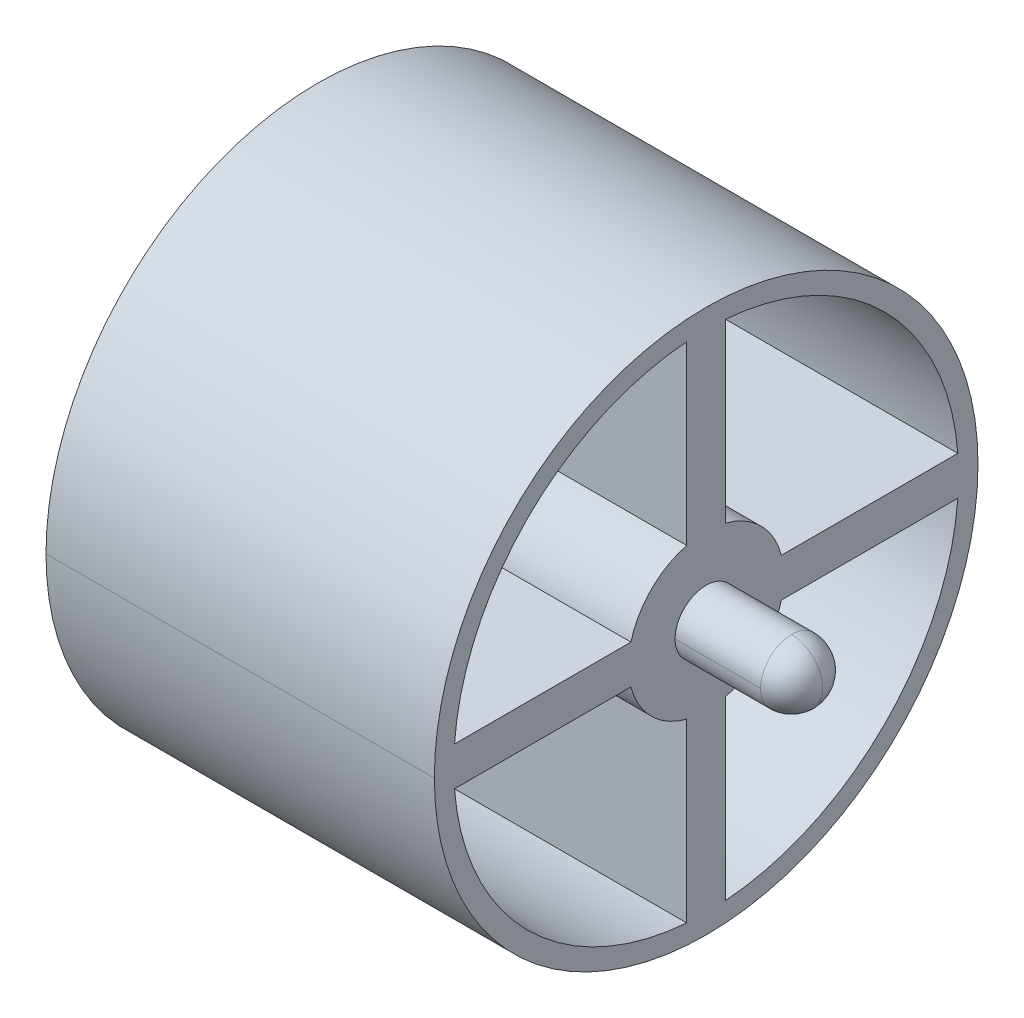
ISO-10303-21;
HEADER;
FILE_DESCRIPTION(('STEP AP214'),'2;1');
FILE_NAME('part.step','',(''),(''),'','','');
FILE_SCHEMA(('AUTOMOTIVE_DESIGN { 1 0 10303 214 1 1 1 1 }'));
ENDSEC;
DATA;
#1=APPLICATION_CONTEXT('core data for automotive mechanical design processes');
#2=APPLICATION_PROTOCOL_DEFINITION('international standard','automotive_design',2000,#1);
#3=PRODUCT_CONTEXT('',#1,'mechanical');
#4=PRODUCT('Part','Part','',(#3));
#5=PRODUCT_RELATED_PRODUCT_CATEGORY('part','',(#4));
#6=PRODUCT_DEFINITION_FORMATION('','',#4);
#7=PRODUCT_DEFINITION_CONTEXT('part definition',#1,'design');
#8=PRODUCT_DEFINITION('design','',#6,#7);
#9=PRODUCT_DEFINITION_SHAPE('','',#8);
#10=(LENGTH_UNIT() NAMED_UNIT(*) SI_UNIT(.MILLI.,.METRE.));
#11=(NAMED_UNIT(*) PLANE_ANGLE_UNIT() SI_UNIT($,.RADIAN.));
#12=(NAMED_UNIT(*) SI_UNIT($,.STERADIAN.) SOLID_ANGLE_UNIT());
#13=UNCERTAINTY_MEASURE_WITH_UNIT(LENGTH_MEASURE(1.E-05),#10,'distance_accuracy_value','');
#14=(GEOMETRIC_REPRESENTATION_CONTEXT(3) GLOBAL_UNCERTAINTY_ASSIGNED_CONTEXT((#13)) GLOBAL_UNIT_ASSIGNED_CONTEXT((#10,
#11,#12)) REPRESENTATION_CONTEXT('',''));
#15=CARTESIAN_POINT('',(0.,0.,0.));
#16=DIRECTION('',(0.,0.,1.));
#17=DIRECTION('',(1.,0.,0.));
#18=AXIS2_PLACEMENT_3D('',#15,#16,#17);
#19=CARTESIAN_POINT('',(10.,0.5,0.));
#20=DIRECTION('',(0.,1.,0.));
#21=DIRECTION('',(0.,0.,-1.));
#22=AXIS2_PLACEMENT_3D('',#19,#20,#21);
#23=PLANE('',#22);
#24=DIRECTION('',(-1.,0.,0.));
#25=VECTOR('',#24,1.);
#26=CARTESIAN_POINT('',(-4.64336153156042,0.499999999999993,-1.93649167310348));
#27=LINE('',#26,#25);
#28=CARTESIAN_POINT('',(10.,0.499999999999993,-1.93649167310348));
#29=VERTEX_POINT('',#28);
#30=CARTESIAN_POINT('',(0.,0.499999999999993,-1.93649167310348));
#31=VERTEX_POINT('',#30);
#32=EDGE_CURVE('E254',#29,#31,#27,.T.);
#33=ORIENTED_EDGE('',*,*,#32,.F.);
#34=DIRECTION('',(0.,0.,-1.));
#35=VECTOR('',#34,1.);
#36=CARTESIAN_POINT('',(10.,0.5,0.));
#37=LINE('',#36,#35);
#38=CARTESIAN_POINT('',(10.,0.499999999999982,-6.48074069840781));
#39=VERTEX_POINT('',#38);
#40=EDGE_CURVE('E247',#29,#39,#37,.T.);
#41=ORIENTED_EDGE('',*,*,#40,.T.);
#42=DIRECTION('',(1.,0.,0.));
#43=VECTOR('',#42,1.);
#44=CARTESIAN_POINT('',(-4.64336153156042,0.499999999999977,-6.48074069840776));
#45=LINE('',#44,#43);
#46=CARTESIAN_POINT('',(0.,0.499999999999973,-6.4807406984077));
#47=VERTEX_POINT('',#46);
#48=EDGE_CURVE('E11',#47,#39,#45,.T.);
#49=ORIENTED_EDGE('',*,*,#48,.F.);
#50=DIRECTION('',(0.,0.,-1.));
#51=VECTOR('',#50,1.);
#52=CARTESIAN_POINT('',(0.,0.5,0.));
#53=LINE('',#52,#51);
#54=EDGE_CURVE('E196',#31,#47,#53,.T.);
#55=ORIENTED_EDGE('',*,*,#54,.F.);
#56=EDGE_LOOP('',(#33,#41,#49,#55));
#57=FACE_BOUND('',#56,.T.);
#58=ADVANCED_FACE('F17',(#57),#23,.T.);
#59=CARTESIAN_POINT('',(10.,-0.500000000000024,-6.8));
#60=DIRECTION('',(0.,-1.,0.));
#61=DIRECTION('',(-1.,0.,0.));
#62=AXIS2_PLACEMENT_3D('',#59,#60,#61);
#63=PLANE('',#62);
#64=DIRECTION('',(1.,0.,0.));
#65=VECTOR('',#64,1.);
#66=CARTESIAN_POINT('',(-4.64336153156042,-0.500000000000007,-1.93649167310348));
#67=LINE('',#66,#65);
#68=CARTESIAN_POINT('',(0.,-0.500000000000007,-1.93649167310348));
#69=VERTEX_POINT('',#68);
#70=CARTESIAN_POINT('',(10.,-0.500000000000007,-1.93649167310348));
#71=VERTEX_POINT('',#70);
#72=EDGE_CURVE('E367',#69,#71,#67,.T.);
#73=ORIENTED_EDGE('',*,*,#72,.F.);
#74=DIRECTION('',(0.,0.,1.));
#75=VECTOR('',#74,1.);
#76=CARTESIAN_POINT('',(0.,-0.500000000000024,-6.8));
#77=LINE('',#76,#75);
#78=CARTESIAN_POINT('',(0.,-0.500000000000023,-6.48074069840775));
#79=VERTEX_POINT('',#78);
#80=EDGE_CURVE('E192',#79,#69,#77,.T.);
#81=ORIENTED_EDGE('',*,*,#80,.F.);
#82=DIRECTION('',(-1.,0.,0.));
#83=VECTOR('',#82,1.);
#84=CARTESIAN_POINT('',(-4.64336153156042,-0.500000000000023,-6.48074069840775));
#85=LINE('',#84,#83);
#86=CARTESIAN_POINT('',(10.,-0.500000000000027,-6.48074069840781));
#87=VERTEX_POINT('',#86);
#88=EDGE_CURVE('E290',#87,#79,#85,.T.);
#89=ORIENTED_EDGE('',*,*,#88,.F.);
#90=DIRECTION('',(0.,0.,1.));
#91=VECTOR('',#90,1.);
#92=CARTESIAN_POINT('',(10.,-0.500000000000024,-6.8));
#93=LINE('',#92,#91);
#94=EDGE_CURVE('E342',#87,#71,#93,.T.);
#95=ORIENTED_EDGE('',*,*,#94,.T.);
#96=EDGE_LOOP('',(#73,#81,#89,#95));
#97=FACE_BOUND('',#96,.T.);
#98=ADVANCED_FACE('F475',(#97),#63,.T.);
#99=CARTESIAN_POINT('',(10.,-6.8,0.5));
#100=DIRECTION('',(0.,0.,1.));
#101=DIRECTION('',(1.,0.,0.));
#102=AXIS2_PLACEMENT_3D('',#99,#100,#101);
#103=PLANE('',#102);
#104=DIRECTION('',(1.,0.,0.));
#105=VECTOR('',#104,1.);
#106=CARTESIAN_POINT('',(-4.64336153156042,-1.93649167310348,0.5));
#107=LINE('',#106,#105);
#108=CARTESIAN_POINT('',(0.,-1.93649167310348,0.5));
#109=VERTEX_POINT('',#108);
#110=CARTESIAN_POINT('',(10.,-1.93649167310348,0.5));
#111=VERTEX_POINT('',#110);
#112=EDGE_CURVE('E236',#109,#111,#107,.T.);
#113=ORIENTED_EDGE('',*,*,#112,.F.);
#114=DIRECTION('',(0.,1.,0.));
#115=VECTOR('',#114,1.);
#116=CARTESIAN_POINT('',(0.,-6.8,0.5));
#117=LINE('',#116,#115);
#118=CARTESIAN_POINT('',(0.,-6.48074069840776,0.5));
#119=VERTEX_POINT('',#118);
#120=EDGE_CURVE('E186',#119,#109,#117,.T.);
#121=ORIENTED_EDGE('',*,*,#120,.F.);
#122=DIRECTION('',(-1.,0.,0.));
#123=VECTOR('',#122,1.);
#124=CARTESIAN_POINT('',(-4.64336153156042,-6.48074069840776,0.5));
#125=LINE('',#124,#123);
#126=CARTESIAN_POINT('',(10.,-6.48074069840776,0.5));
#127=VERTEX_POINT('',#126);
#128=EDGE_CURVE('E319',#127,#119,#125,.T.);
#129=ORIENTED_EDGE('',*,*,#128,.F.);
#130=DIRECTION('',(0.,1.,0.));
#131=VECTOR('',#130,1.);
#132=CARTESIAN_POINT('',(10.,-6.8,0.5));
#133=LINE('',#132,#131);
#134=EDGE_CURVE('E398',#127,#111,#133,.T.);
#135=ORIENTED_EDGE('',*,*,#134,.T.);
#136=EDGE_LOOP('',(#113,#121,#129,#135));
#137=FACE_BOUND('',#136,.T.);
#138=ADVANCED_FACE('F397',(#137),#103,.T.);
#139=CARTESIAN_POINT('',(10.,0.,-0.5));
#140=DIRECTION('',(0.,0.,-1.));
#141=DIRECTION('',(0.,-1.,0.));
#142=AXIS2_PLACEMENT_3D('',#139,#140,#141);
#143=PLANE('',#142);
#144=DIRECTION('',(-1.,0.,0.));
#145=VECTOR('',#144,1.);
#146=CARTESIAN_POINT('',(-4.64336153156042,-1.93649167310348,-0.5));
#147=LINE('',#146,#145);
#148=CARTESIAN_POINT('',(10.,-1.93649167310348,-0.5));
#149=VERTEX_POINT('',#148);
#150=CARTESIAN_POINT('',(0.,-1.93649167310348,-0.5));
#151=VERTEX_POINT('',#150);
#152=EDGE_CURVE('E348',#149,#151,#147,.T.);
#153=ORIENTED_EDGE('',*,*,#152,.F.);
#154=DIRECTION('',(0.,-1.,0.));
#155=VECTOR('',#154,1.);
#156=CARTESIAN_POINT('',(10.,0.,-0.5));
#157=LINE('',#156,#155);
#158=CARTESIAN_POINT('',(10.,-6.48074069840781,-0.5));
#159=VERTEX_POINT('',#158);
#160=EDGE_CURVE('E338',#149,#159,#157,.T.);
#161=ORIENTED_EDGE('',*,*,#160,.T.);
#162=DIRECTION('',(1.,0.,0.));
#163=VECTOR('',#162,1.);
#164=CARTESIAN_POINT('',(-4.64336153156042,-6.48074069840776,-0.5));
#165=LINE('',#164,#163);
#166=CARTESIAN_POINT('',(0.,-6.48074069840776,-0.5));
#167=VERTEX_POINT('',#166);
#168=EDGE_CURVE('E355',#167,#159,#165,.T.);
#169=ORIENTED_EDGE('',*,*,#168,.F.);
#170=DIRECTION('',(0.,-1.,0.));
#171=VECTOR('',#170,1.);
#172=CARTESIAN_POINT('',(0.,0.,-0.5));
#173=LINE('',#172,#171);
#174=EDGE_CURVE('E190',#151,#167,#173,.T.);
#175=ORIENTED_EDGE('',*,*,#174,.F.);
#176=EDGE_LOOP('',(#153,#161,#169,#175));
#177=FACE_BOUND('',#176,.T.);
#178=ADVANCED_FACE('F790',(#177),#143,.T.);
#179=CARTESIAN_POINT('',(10.,0.5,0.));
#180=DIRECTION('',(0.,1.,0.));
#181=DIRECTION('',(0.,0.,-1.));
#182=AXIS2_PLACEMENT_3D('',#179,#180,#181);
#183=PLANE('',#182);
#184=DIRECTION('',(1.,0.,0.));
#185=VECTOR('',#184,1.);
#186=CARTESIAN_POINT('',(-4.64336153156042,0.500000000000007,1.93649167310348));
#187=LINE('',#186,#185);
#188=CARTESIAN_POINT('',(0.,0.500000000000007,1.93649167310348));
#189=VERTEX_POINT('',#188);
#190=CARTESIAN_POINT('',(10.,0.500000000000007,1.93649167310348));
#191=VERTEX_POINT('',#190);
#192=EDGE_CURVE('E156',#189,#191,#187,.T.);
#193=ORIENTED_EDGE('',*,*,#192,.F.);
#194=DIRECTION('',(0.,0.,-1.));
#195=VECTOR('',#194,1.);
#196=CARTESIAN_POINT('',(0.,0.5,0.));
#197=LINE('',#196,#195);
#198=CARTESIAN_POINT('',(0.,0.500000000000023,6.48074069840775));
#199=VERTEX_POINT('',#198);
#200=EDGE_CURVE('E139',#199,#189,#197,.T.);
#201=ORIENTED_EDGE('',*,*,#200,.F.);
#202=DIRECTION('',(-1.,0.,0.));
#203=VECTOR('',#202,1.);
#204=CARTESIAN_POINT('',(-4.64336153156042,0.500000000000023,6.48074069840775));
#205=LINE('',#204,#203);
#206=CARTESIAN_POINT('',(10.,0.500000000000023,6.48074069840775));
#207=VERTEX_POINT('',#206);
#208=EDGE_CURVE('E200',#207,#199,#205,.T.);
#209=ORIENTED_EDGE('',*,*,#208,.F.);
#210=DIRECTION('',(0.,0.,-1.));
#211=VECTOR('',#210,1.);
#212=CARTESIAN_POINT('',(10.,0.5,0.));
#213=LINE('',#212,#211);
#214=EDGE_CURVE('E158',#207,#191,#213,.T.);
#215=ORIENTED_EDGE('',*,*,#214,.T.);
#216=EDGE_LOOP('',(#193,#201,#209,#215));
#217=FACE_BOUND('',#216,.T.);
#218=ADVANCED_FACE('F157',(#217),#183,.T.);
#219=CARTESIAN_POINT('',(10.,-0.5,0.));
#220=DIRECTION('',(0.,-1.,0.));
#221=DIRECTION('',(-1.,0.,0.));
#222=AXIS2_PLACEMENT_3D('',#219,#220,#221);
#223=PLANE('',#222);
#224=DIRECTION('',(-1.,0.,0.));
#225=VECTOR('',#224,1.);
#226=CARTESIAN_POINT('',(-4.64336153156042,-0.49999999999998,1.93649167310348));
#227=LINE('',#226,#225);
#228=CARTESIAN_POINT('',(10.,-0.49999999999998,1.93649167310348));
#229=VERTEX_POINT('',#228);
#230=CARTESIAN_POINT('',(0.,-0.49999999999998,1.93649167310348));
#231=VERTEX_POINT('',#230);
#232=EDGE_CURVE('E170',#229,#231,#227,.T.);
#233=ORIENTED_EDGE('',*,*,#232,.F.);
#234=DIRECTION('',(0.,0.,1.));
#235=VECTOR('',#234,1.);
#236=CARTESIAN_POINT('',(10.,-0.5,0.));
#237=LINE('',#236,#235);
#238=CARTESIAN_POINT('',(10.,-0.499999999999936,6.48074069840782));
#239=VERTEX_POINT('',#238);
#240=EDGE_CURVE('E329',#229,#239,#237,.T.);
#241=ORIENTED_EDGE('',*,*,#240,.T.);
#242=DIRECTION('',(1.,0.,0.));
#243=VECTOR('',#242,1.);
#244=CARTESIAN_POINT('',(-4.64336153156042,-0.499999999999932,6.48074069840776));
#245=LINE('',#244,#243);
#246=CARTESIAN_POINT('',(0.,-0.499999999999932,6.48074069840776));
#247=VERTEX_POINT('',#246);
#248=EDGE_CURVE('E308',#247,#239,#245,.T.);
#249=ORIENTED_EDGE('',*,*,#248,.F.);
#250=DIRECTION('',(0.,0.,1.));
#251=VECTOR('',#250,1.);
#252=CARTESIAN_POINT('',(0.,-0.5,0.));
#253=LINE('',#252,#251);
#254=EDGE_CURVE('E191',#231,#247,#253,.T.);
#255=ORIENTED_EDGE('',*,*,#254,.F.);
#256=EDGE_LOOP('',(#233,#241,#249,#255));
#257=FACE_BOUND('',#256,.T.);
#258=ADVANCED_FACE('F412',(#257),#223,.T.);
#259=CARTESIAN_POINT('',(-4.64336153156042,0.,0.));
#260=DIRECTION('',(-1.,0.,0.));
#261=DIRECTION('',(0.,0.,1.));
#262=AXIS2_PLACEMENT_3D('',#259,#260,#261);
#263=CYLINDRICAL_SURFACE('',#262,6.4999999999999);
#264=CARTESIAN_POINT('',(0.,0.,0.));
#265=DIRECTION('',(-1.,0.,0.));
#266=DIRECTION('',(0.,0.,1.));
#267=AXIS2_PLACEMENT_3D('',#264,#265,#266);
#268=CIRCLE('',#267,6.49999999999984);
#269=CARTESIAN_POINT('',(0.,6.48074069840776,-0.5));
#270=VERTEX_POINT('',#269);
#271=EDGE_CURVE('E153',#270,#47,#268,.T.);
#272=ORIENTED_EDGE('',*,*,#271,.T.);
#273=ORIENTED_EDGE('',*,*,#48,.T.);
#274=CARTESIAN_POINT('',(10.,0.,0.));
#275=DIRECTION('',(-1.,0.,0.));
#276=DIRECTION('',(0.,0.,1.));
#277=AXIS2_PLACEMENT_3D('',#274,#275,#276);
#278=CIRCLE('',#277,6.5);
#279=CARTESIAN_POINT('',(10.,6.48074069840781,-0.5));
#280=VERTEX_POINT('',#279);
#281=EDGE_CURVE('E250',#280,#39,#278,.T.);
#282=ORIENTED_EDGE('',*,*,#281,.F.);
#283=DIRECTION('',(1.,0.,0.));
#284=VECTOR('',#283,1.);
#285=CARTESIAN_POINT('',(-4.64336153156042,6.48074069840776,-0.5));
#286=LINE('',#285,#284);
#287=EDGE_CURVE('E201',#270,#280,#286,.T.);
#288=ORIENTED_EDGE('',*,*,#287,.F.);
#289=EDGE_LOOP('',(#272,#273,#282,#288));
#290=FACE_BOUND('',#289,.T.);
#291=ADVANCED_FACE('F727',(#290),#263,.F.);
#292=CARTESIAN_POINT('',(-4.64336153156042,0.,0.));
#293=DIRECTION('',(-1.,0.,0.));
#294=DIRECTION('',(0.,0.,1.));
#295=AXIS2_PLACEMENT_3D('',#292,#293,#294);
#296=CYLINDRICAL_SURFACE('',#295,6.9999999999999);
#297=DIRECTION('',(-1.,0.,0.));
#298=VECTOR('',#297,1.);
#299=CARTESIAN_POINT('',(-4.64336153156042,0.,-6.9999999999999));
#300=LINE('',#299,#298);
#301=CARTESIAN_POINT('',(10.,0.,-6.9999999999999));
#302=VERTEX_POINT('',#301);
#303=CARTESIAN_POINT('',(0.,0.,-6.9999999999999));
#304=VERTEX_POINT('',#303);
#305=EDGE_CURVE('E215',#302,#304,#300,.T.);
#306=ORIENTED_EDGE('',*,*,#305,.F.);
#307=CARTESIAN_POINT('',(10.,0.,0.));
#308=DIRECTION('',(-1.,0.,0.));
#309=DIRECTION('',(0.,0.,1.));
#310=AXIS2_PLACEMENT_3D('',#307,#308,#309);
#311=CIRCLE('',#310,6.9999999999999);
#312=CARTESIAN_POINT('',(10.,0.,6.9999999999999));
#313=VERTEX_POINT('',#312);
#314=EDGE_CURVE('E427',#302,#313,#311,.T.);
#315=ORIENTED_EDGE('',*,*,#314,.T.);
#316=DIRECTION('',(-1.,0.,0.));
#317=VECTOR('',#316,1.);
#318=CARTESIAN_POINT('',(-4.64336153156042,0.,6.9999999999999));
#319=LINE('',#318,#317);
#320=CARTESIAN_POINT('',(0.,0.,6.9999999999999));
#321=VERTEX_POINT('',#320);
#322=EDGE_CURVE('E214',#313,#321,#319,.T.);
#323=ORIENTED_EDGE('',*,*,#322,.T.);
#324=CARTESIAN_POINT('',(0.,0.,0.));
#325=DIRECTION('',(-1.,0.,0.));
#326=DIRECTION('',(0.,0.,1.));
#327=AXIS2_PLACEMENT_3D('',#324,#325,#326);
#328=CIRCLE('',#327,6.9999999999999);
#329=EDGE_CURVE('E222',#304,#321,#328,.T.);
#330=ORIENTED_EDGE('',*,*,#329,.F.);
#331=EDGE_LOOP('',(#306,#315,#323,#330));
#332=FACE_BOUND('',#331,.T.);
#333=ADVANCED_FACE('F732',(#332),#296,.T.);
#334=CARTESIAN_POINT('',(-4.64336153156042,0.,0.));
#335=DIRECTION('',(-1.,0.,0.));
#336=DIRECTION('',(0.,0.,1.));
#337=AXIS2_PLACEMENT_3D('',#334,#335,#336);
#338=CYLINDRICAL_SURFACE('',#337,0.799999999999912);
#339=DIRECTION('',(-1.,0.,0.));
#340=VECTOR('',#339,1.);
#341=CARTESIAN_POINT('',(-4.64336153156042,0.,-0.799999999999912));
#342=LINE('',#341,#340);
#343=CARTESIAN_POINT('',(0.,0.,-0.799999999999912));
#344=VERTEX_POINT('',#343);
#345=CARTESIAN_POINT('',(-2.2000000000002,0.,-0.799999999999912));
#346=VERTEX_POINT('',#345);
#347=EDGE_CURVE('E21',#344,#346,#342,.T.);
#348=ORIENTED_EDGE('',*,*,#347,.F.);
#349=CARTESIAN_POINT('',(0.,0.,0.));
#350=DIRECTION('',(-1.,0.,0.));
#351=DIRECTION('',(0.,0.,1.));
#352=AXIS2_PLACEMENT_3D('',#349,#350,#351);
#353=CIRCLE('',#352,0.799999999999912);
#354=CARTESIAN_POINT('',(0.,0.,0.799999999999912));
#355=VERTEX_POINT('',#354);
#356=EDGE_CURVE('E28',#344,#355,#353,.T.);
#357=ORIENTED_EDGE('',*,*,#356,.T.);
#358=DIRECTION('',(-1.,0.,0.));
#359=VECTOR('',#358,1.);
#360=CARTESIAN_POINT('',(-4.64336153156042,0.,0.799999999999912));
#361=LINE('',#360,#359);
#362=CARTESIAN_POINT('',(-2.2000000000002,0.,0.799999999999912));
#363=VERTEX_POINT('',#362);
#364=EDGE_CURVE('E275',#355,#363,#361,.T.);
#365=ORIENTED_EDGE('',*,*,#364,.T.);
#366=CARTESIAN_POINT('',(-2.2000000000002,0.,0.));
#367=DIRECTION('',(-1.,0.,0.));
#368=DIRECTION('',(0.,0.,1.));
#369=AXIS2_PLACEMENT_3D('',#366,#367,#368);
#370=CIRCLE('',#369,0.799999999999912);
#371=CARTESIAN_POINT('',(-2.2000000000002,-0.800000000000023,0.));
#372=VERTEX_POINT('',#371);
#373=EDGE_CURVE('E263',#372,#363,#370,.T.);
#374=ORIENTED_EDGE('',*,*,#373,.F.);
#375=CARTESIAN_POINT('',(-2.2000000000002,0.,0.));
#376=DIRECTION('',(-1.,0.,0.));
#377=DIRECTION('',(0.,0.,1.));
#378=AXIS2_PLACEMENT_3D('',#375,#376,#377);
#379=CIRCLE('',#378,0.799999999999912);
#380=EDGE_CURVE('E337',#346,#372,#379,.T.);
#381=ORIENTED_EDGE('',*,*,#380,.F.);
#382=EDGE_LOOP('',(#348,#357,#365,#374,#381));
#383=FACE_BOUND('',#382,.T.);
#384=ADVANCED_FACE('F717',(#383),#338,.T.);
#385=CARTESIAN_POINT('',(0.,0.,0.));
#386=DIRECTION('',(1.,0.,0.));
#387=DIRECTION('',(0.,1.,0.));
#388=AXIS2_PLACEMENT_3D('',#385,#386,#387);
#389=PLANE('',#388);
#390=CARTESIAN_POINT('',(0.,0.,0.));
#391=DIRECTION('',(-1.,0.,0.));
#392=DIRECTION('',(0.,0.,1.));
#393=AXIS2_PLACEMENT_3D('',#390,#391,#392);
#394=CIRCLE('',#393,0.799999999999912);
#395=EDGE_CURVE('E255',#355,#344,#394,.T.);
#396=ORIENTED_EDGE('',*,*,#395,.F.);
#397=ORIENTED_EDGE('',*,*,#356,.F.);
#398=EDGE_LOOP('',(#396,#397));
#399=FACE_BOUND('',#398,.T.);
#400=ORIENTED_EDGE('',*,*,#200,.T.);
#401=CARTESIAN_POINT('',(0.,0.,0.));
#402=DIRECTION('',(-1.,0.,0.));
#403=DIRECTION('',(0.,0.,1.));
#404=AXIS2_PLACEMENT_3D('',#401,#402,#403);
#405=CIRCLE('',#404,1.99999999999978);
#406=CARTESIAN_POINT('',(0.,1.93649167310348,0.5));
#407=VERTEX_POINT('',#406);
#408=EDGE_CURVE('E145',#189,#407,#405,.T.);
#409=ORIENTED_EDGE('',*,*,#408,.T.);
#410=DIRECTION('',(0.,1.,0.));
#411=VECTOR('',#410,1.);
#412=CARTESIAN_POINT('',(0.,0.,0.5));
#413=LINE('',#412,#411);
#414=CARTESIAN_POINT('',(0.,6.48074069840776,0.5));
#415=VERTEX_POINT('',#414);
#416=EDGE_CURVE('E270',#407,#415,#413,.T.);
#417=ORIENTED_EDGE('',*,*,#416,.T.);
#418=CARTESIAN_POINT('',(0.,0.,0.));
#419=DIRECTION('',(-1.,0.,0.));
#420=DIRECTION('',(0.,0.,1.));
#421=AXIS2_PLACEMENT_3D('',#418,#419,#420);
#422=CIRCLE('',#421,6.49999999999984);
#423=EDGE_CURVE('E148',#199,#415,#422,.T.);
#424=ORIENTED_EDGE('',*,*,#423,.F.);
#425=EDGE_LOOP('',(#400,#409,#417,#424));
#426=FACE_BOUND('',#425,.T.);
#427=CARTESIAN_POINT('',(0.,0.,0.));
#428=DIRECTION('',(-1.,0.,0.));
#429=DIRECTION('',(0.,0.,1.));
#430=AXIS2_PLACEMENT_3D('',#427,#428,#429);
#431=CIRCLE('',#430,1.99999999999978);
#432=CARTESIAN_POINT('',(0.,1.93649167310348,-0.5));
#433=VERTEX_POINT('',#432);
#434=EDGE_CURVE('E224',#433,#31,#431,.T.);
#435=ORIENTED_EDGE('',*,*,#434,.T.);
#436=ORIENTED_EDGE('',*,*,#54,.T.);
#437=ORIENTED_EDGE('',*,*,#271,.F.);
#438=DIRECTION('',(0.,-1.,0.));
#439=VECTOR('',#438,1.);
#440=CARTESIAN_POINT('',(0.,6.8,-0.5));
#441=LINE('',#440,#439);
#442=EDGE_CURVE('E206',#270,#433,#441,.T.);
#443=ORIENTED_EDGE('',*,*,#442,.T.);
#444=EDGE_LOOP('',(#435,#436,#437,#443));
#445=FACE_BOUND('',#444,.T.);
#446=CARTESIAN_POINT('',(0.,0.,0.));
#447=DIRECTION('',(-1.,0.,0.));
#448=DIRECTION('',(0.,0.,1.));
#449=AXIS2_PLACEMENT_3D('',#446,#447,#448);
#450=CIRCLE('',#449,1.99999999999978);
#451=EDGE_CURVE('E302',#69,#151,#450,.T.);
#452=ORIENTED_EDGE('',*,*,#451,.T.);
#453=ORIENTED_EDGE('',*,*,#174,.T.);
#454=CARTESIAN_POINT('',(0.,0.,0.));
#455=DIRECTION('',(-1.,0.,0.));
#456=DIRECTION('',(0.,0.,1.));
#457=AXIS2_PLACEMENT_3D('',#454,#455,#456);
#458=CIRCLE('',#457,6.49999999999984);
#459=EDGE_CURVE('E294',#79,#167,#458,.T.);
#460=ORIENTED_EDGE('',*,*,#459,.F.);
#461=ORIENTED_EDGE('',*,*,#80,.T.);
#462=EDGE_LOOP('',(#452,#453,#460,#461));
#463=FACE_BOUND('',#462,.T.);
#464=CARTESIAN_POINT('',(0.,0.,0.));
#465=DIRECTION('',(-1.,0.,0.));
#466=DIRECTION('',(0.,0.,1.));
#467=AXIS2_PLACEMENT_3D('',#464,#465,#466);
#468=CIRCLE('',#467,1.99999999999978);
#469=EDGE_CURVE('E240',#109,#231,#468,.T.);
#470=ORIENTED_EDGE('',*,*,#469,.T.);
#471=ORIENTED_EDGE('',*,*,#254,.T.);
#472=CARTESIAN_POINT('',(0.,0.,0.));
#473=DIRECTION('',(-1.,0.,0.));
#474=DIRECTION('',(0.,0.,1.));
#475=AXIS2_PLACEMENT_3D('',#472,#473,#474);
#476=CIRCLE('',#475,6.49999999999984);
#477=EDGE_CURVE('E315',#119,#247,#476,.T.);
#478=ORIENTED_EDGE('',*,*,#477,.F.);
#479=ORIENTED_EDGE('',*,*,#120,.T.);
#480=EDGE_LOOP('',(#470,#471,#478,#479));
#481=FACE_BOUND('',#480,.T.);
#482=CARTESIAN_POINT('',(0.,0.,0.));
#483=DIRECTION('',(-1.,0.,0.));
#484=DIRECTION('',(0.,0.,1.));
#485=AXIS2_PLACEMENT_3D('',#482,#483,#484);
#486=CIRCLE('',#485,6.9999999999999);
#487=EDGE_CURVE('E210',#321,#304,#486,.T.);
#488=ORIENTED_EDGE('',*,*,#487,.T.);
#489=ORIENTED_EDGE('',*,*,#329,.T.);
#490=EDGE_LOOP('',(#488,#489));
#491=FACE_BOUND('',#490,.T.);
#492=ADVANCED_FACE('F141',(#399,#426,#445,#463,#481,#491),#389,.F.);
#493=CARTESIAN_POINT('',(-4.64336153156042,0.,0.));
#494=DIRECTION('',(-1.,0.,0.));
#495=DIRECTION('',(0.,0.,1.));
#496=AXIS2_PLACEMENT_3D('',#493,#494,#495);
#497=CYLINDRICAL_SURFACE('',#496,1.99999999999978);
#498=CARTESIAN_POINT('',(10.,0.,0.));
#499=DIRECTION('',(-1.,0.,0.));
#500=DIRECTION('',(0.,0.,1.));
#501=AXIS2_PLACEMENT_3D('',#498,#499,#500);
#502=CIRCLE('',#501,1.99999999999978);
#503=CARTESIAN_POINT('',(10.,1.93649167310348,-0.5));
#504=VERTEX_POINT('',#503);
#505=EDGE_CURVE('E182',#504,#29,#502,.T.);
#506=ORIENTED_EDGE('',*,*,#505,.T.);
#507=ORIENTED_EDGE('',*,*,#32,.T.);
#508=ORIENTED_EDGE('',*,*,#434,.F.);
#509=DIRECTION('',(1.,0.,0.));
#510=VECTOR('',#509,1.);
#511=CARTESIAN_POINT('',(-4.64336153156042,1.93649167310348,-0.5));
#512=LINE('',#511,#510);
#513=EDGE_CURVE('E229',#433,#504,#512,.T.);
#514=ORIENTED_EDGE('',*,*,#513,.T.);
#515=EDGE_LOOP('',(#506,#507,#508,#514));
#516=FACE_BOUND('',#515,.T.);
#517=ADVANCED_FACE('F655',(#516),#497,.T.);
#518=CARTESIAN_POINT('',(10.,0.,0.));
#519=DIRECTION('',(1.,0.,0.));
#520=DIRECTION('',(0.,1.,0.));
#521=AXIS2_PLACEMENT_3D('',#518,#519,#520);
#522=PLANE('',#521);
#523=CARTESIAN_POINT('',(10.,0.,0.));
#524=DIRECTION('',(-1.,0.,0.));
#525=DIRECTION('',(0.,0.,1.));
#526=AXIS2_PLACEMENT_3D('',#523,#524,#525);
#527=CIRCLE('',#526,0.799999999999912);
#528=CARTESIAN_POINT('',(10.,0.,0.799999999999912));
#529=VERTEX_POINT('',#528);
#530=CARTESIAN_POINT('',(10.,0.,-0.799999999999912));
#531=VERTEX_POINT('',#530);
#532=EDGE_CURVE('E241',#529,#531,#527,.T.);
#533=ORIENTED_EDGE('',*,*,#532,.T.);
#534=CARTESIAN_POINT('',(10.,0.,0.));
#535=DIRECTION('',(-1.,0.,0.));
#536=DIRECTION('',(0.,0.,1.));
#537=AXIS2_PLACEMENT_3D('',#534,#535,#536);
#538=CIRCLE('',#537,0.799999999999912);
#539=EDGE_CURVE('E262',#531,#529,#538,.T.);
#540=ORIENTED_EDGE('',*,*,#539,.T.);
#541=EDGE_LOOP('',(#533,#540));
#542=FACE_BOUND('',#541,.T.);
#543=CARTESIAN_POINT('',(10.,0.,0.));
#544=DIRECTION('',(-1.,0.,0.));
#545=DIRECTION('',(0.,0.,1.));
#546=AXIS2_PLACEMENT_3D('',#543,#544,#545);
#547=CIRCLE('',#546,1.99999999999978);
#548=EDGE_CURVE('E178',#111,#229,#547,.T.);
#549=ORIENTED_EDGE('',*,*,#548,.F.);
#550=ORIENTED_EDGE('',*,*,#134,.F.);
#551=CARTESIAN_POINT('',(10.,0.,0.));
#552=DIRECTION('',(-1.,0.,0.));
#553=DIRECTION('',(0.,0.,1.));
#554=AXIS2_PLACEMENT_3D('',#551,#552,#553);
#555=CIRCLE('',#554,6.5);
#556=EDGE_CURVE('E376',#127,#239,#555,.T.);
#557=ORIENTED_EDGE('',*,*,#556,.T.);
#558=ORIENTED_EDGE('',*,*,#240,.F.);
#559=EDGE_LOOP('',(#549,#550,#557,#558));
#560=FACE_BOUND('',#559,.T.);
#561=CARTESIAN_POINT('',(10.,0.,0.));
#562=DIRECTION('',(-1.,0.,0.));
#563=DIRECTION('',(0.,0.,1.));
#564=AXIS2_PLACEMENT_3D('',#561,#562,#563);
#565=CIRCLE('',#564,1.99999999999978);
#566=CARTESIAN_POINT('',(10.,1.93649167310348,0.5));
#567=VERTEX_POINT('',#566);
#568=EDGE_CURVE('E163',#191,#567,#565,.T.);
#569=ORIENTED_EDGE('',*,*,#568,.F.);
#570=ORIENTED_EDGE('',*,*,#214,.F.);
#571=CARTESIAN_POINT('',(10.,0.,0.));
#572=DIRECTION('',(-1.,0.,0.));
#573=DIRECTION('',(0.,0.,1.));
#574=AXIS2_PLACEMENT_3D('',#571,#572,#573);
#575=CIRCLE('',#574,6.5);
#576=CARTESIAN_POINT('',(10.,6.48074069840781,0.5));
#577=VERTEX_POINT('',#576);
#578=EDGE_CURVE('E304',#207,#577,#575,.T.);
#579=ORIENTED_EDGE('',*,*,#578,.T.);
#580=DIRECTION('',(0.,1.,0.));
#581=VECTOR('',#580,1.);
#582=CARTESIAN_POINT('',(10.,0.,0.5));
#583=LINE('',#582,#581);
#584=EDGE_CURVE('E358',#567,#577,#583,.T.);
#585=ORIENTED_EDGE('',*,*,#584,.F.);
#586=EDGE_LOOP('',(#569,#570,#579,#585));
#587=FACE_BOUND('',#586,.T.);
#588=ORIENTED_EDGE('',*,*,#281,.T.);
#589=ORIENTED_EDGE('',*,*,#40,.F.);
#590=ORIENTED_EDGE('',*,*,#505,.F.);
#591=DIRECTION('',(0.,-1.,0.));
#592=VECTOR('',#591,1.);
#593=CARTESIAN_POINT('',(10.,6.8,-0.5));
#594=LINE('',#593,#592);
#595=EDGE_CURVE('E205',#280,#504,#594,.T.);
#596=ORIENTED_EDGE('',*,*,#595,.F.);
#597=EDGE_LOOP('',(#588,#589,#590,#596));
#598=FACE_BOUND('',#597,.T.);
#599=CARTESIAN_POINT('',(10.,0.,0.));
#600=DIRECTION('',(-1.,0.,0.));
#601=DIRECTION('',(0.,0.,1.));
#602=AXIS2_PLACEMENT_3D('',#599,#600,#601);
#603=CIRCLE('',#602,1.99999999999978);
#604=EDGE_CURVE('E457',#71,#149,#603,.T.);
#605=ORIENTED_EDGE('',*,*,#604,.F.);
#606=ORIENTED_EDGE('',*,*,#94,.F.);
#607=CARTESIAN_POINT('',(10.,0.,0.));
#608=DIRECTION('',(-1.,0.,0.));
#609=DIRECTION('',(0.,0.,1.));
#610=AXIS2_PLACEMENT_3D('',#607,#608,#609);
#611=CIRCLE('',#610,6.5);
#612=EDGE_CURVE('E184',#87,#159,#611,.T.);
#613=ORIENTED_EDGE('',*,*,#612,.T.);
#614=ORIENTED_EDGE('',*,*,#160,.F.);
#615=EDGE_LOOP('',(#605,#606,#613,#614));
#616=FACE_BOUND('',#615,.T.);
#617=CARTESIAN_POINT('',(10.,0.,0.));
#618=DIRECTION('',(-1.,0.,0.));
#619=DIRECTION('',(0.,0.,1.));
#620=AXIS2_PLACEMENT_3D('',#617,#618,#619);
#621=CIRCLE('',#620,6.9999999999999);
#622=EDGE_CURVE('E283',#313,#302,#621,.T.);
#623=ORIENTED_EDGE('',*,*,#622,.F.);
#624=ORIENTED_EDGE('',*,*,#314,.F.);
#625=EDGE_LOOP('',(#623,#624));
#626=FACE_BOUND('',#625,.T.);
#627=ADVANCED_FACE('F651',(#542,#560,#587,#598,#616,#626),#522,.T.);
#628=CARTESIAN_POINT('',(-4.64336153156042,0.,0.));
#629=DIRECTION('',(-1.,0.,0.));
#630=DIRECTION('',(0.,0.,1.));
#631=AXIS2_PLACEMENT_3D('',#628,#629,#630);
#632=CYLINDRICAL_SURFACE('',#631,0.799999999999912);
#633=DIRECTION('',(-1.,0.,0.));
#634=VECTOR('',#633,1.);
#635=CARTESIAN_POINT('',(-4.64336153156042,0.,-0.799999999999912));
#636=LINE('',#635,#634);
#637=CARTESIAN_POINT('',(12.2,0.,-0.799999999999912));
#638=VERTEX_POINT('',#637);
#639=EDGE_CURVE('E246',#638,#531,#636,.T.);
#640=ORIENTED_EDGE('',*,*,#639,.F.);
#641=CARTESIAN_POINT('',(12.2,0.,0.));
#642=DIRECTION('',(-1.,0.,0.));
#643=DIRECTION('',(0.,0.,1.));
#644=AXIS2_PLACEMENT_3D('',#641,#642,#643);
#645=CIRCLE('',#644,0.799999999999912);
#646=CARTESIAN_POINT('',(12.2,-0.79999999999994,0.));
#647=VERTEX_POINT('',#646);
#648=EDGE_CURVE('E288',#638,#647,#645,.T.);
#649=ORIENTED_EDGE('',*,*,#648,.T.);
#650=CARTESIAN_POINT('',(12.2,0.,0.));
#651=DIRECTION('',(-1.,0.,0.));
#652=DIRECTION('',(0.,0.,1.));
#653=AXIS2_PLACEMENT_3D('',#650,#651,#652);
#654=CIRCLE('',#653,0.799999999999912);
#655=CARTESIAN_POINT('',(12.2,0.,0.799999999999912));
#656=VERTEX_POINT('',#655);
#657=EDGE_CURVE('E259',#647,#656,#654,.T.);
#658=ORIENTED_EDGE('',*,*,#657,.T.);
#659=DIRECTION('',(-1.,0.,0.));
#660=VECTOR('',#659,1.);
#661=CARTESIAN_POINT('',(-4.64336153156042,0.,0.799999999999912));
#662=LINE('',#661,#660);
#663=EDGE_CURVE('E245',#656,#529,#662,.T.);
#664=ORIENTED_EDGE('',*,*,#663,.T.);
#665=ORIENTED_EDGE('',*,*,#539,.F.);
#666=EDGE_LOOP('',(#640,#649,#658,#664,#665));
#667=FACE_BOUND('',#666,.T.);
#668=ADVANCED_FACE('F654',(#667),#632,.T.);
#669=CARTESIAN_POINT('',(12.2,0.,0.));
#670=DIRECTION('',(0.,0.,-1.));
#671=DIRECTION('',(0.,1.,0.));
#672=AXIS2_PLACEMENT_3D('',#669,#670,#671);
#673=SPHERICAL_SURFACE('',#672,0.799999999999967);
#674=CARTESIAN_POINT('',(12.2,0.,0.));
#675=DIRECTION('',(0.,0.,-1.));
#676=DIRECTION('',(0.,1.,0.));
#677=AXIS2_PLACEMENT_3D('',#674,#675,#676);
#678=CIRCLE('',#677,0.799999999999967);
#679=CARTESIAN_POINT('',(13.,0.,0.));
#680=VERTEX_POINT('',#679);
#681=EDGE_CURVE('E284',#680,#647,#678,.T.);
#682=ORIENTED_EDGE('',*,*,#681,.F.);
#683=CARTESIAN_POINT('',(12.2,0.,0.));
#684=DIRECTION('',(0.,0.,1.));
#685=DIRECTION('',(1.,0.,0.));
#686=AXIS2_PLACEMENT_3D('',#683,#684,#685);
#687=CIRCLE('',#686,0.799999999999967);
#688=CARTESIAN_POINT('',(12.2,0.79999999999994,0.));
#689=VERTEX_POINT('',#688);
#690=EDGE_CURVE('E289',#680,#689,#687,.T.);
#691=ORIENTED_EDGE('',*,*,#690,.T.);
#692=CARTESIAN_POINT('',(12.2,0.,0.));
#693=DIRECTION('',(-1.,0.,0.));
#694=DIRECTION('',(0.,0.,1.));
#695=AXIS2_PLACEMENT_3D('',#692,#693,#694);
#696=CIRCLE('',#695,0.799999999999912);
#697=EDGE_CURVE('E330',#656,#689,#696,.T.);
#698=ORIENTED_EDGE('',*,*,#697,.F.);
#699=ORIENTED_EDGE('',*,*,#657,.F.);
#700=EDGE_LOOP('',(#682,#691,#698,#699));
#701=FACE_BOUND('',#700,.T.);
#702=ADVANCED_FACE('F694',(#701),#673,.T.);
#703=CARTESIAN_POINT('',(-2.2000000000002,-1.11022302462516E-13,0.));
#704=DIRECTION('',(0.,0.,-1.));
#705=DIRECTION('',(0.,1.,0.));
#706=AXIS2_PLACEMENT_3D('',#703,#704,#705);
#707=SPHERICAL_SURFACE('',#706,0.800000000000023);
#708=CARTESIAN_POINT('',(-2.2000000000002,-1.11022302462516E-13,0.));
#709=DIRECTION('',(0.,0.,-1.));
#710=DIRECTION('',(0.,1.,0.));
#711=AXIS2_PLACEMENT_3D('',#708,#709,#710);
#712=CIRCLE('',#711,0.800000000000023);
#713=CARTESIAN_POINT('',(-3.00000000000023,-1.1097331659055E-13,0.));
#714=VERTEX_POINT('',#713);
#715=EDGE_CURVE('E303',#372,#714,#712,.T.);
#716=ORIENTED_EDGE('',*,*,#715,.F.);
#717=ORIENTED_EDGE('',*,*,#373,.T.);
#718=CARTESIAN_POINT('',(-2.2000000000002,0.,0.));
#719=DIRECTION('',(-1.,0.,0.));
#720=DIRECTION('',(0.,0.,1.));
#721=AXIS2_PLACEMENT_3D('',#718,#719,#720);
#722=CIRCLE('',#721,0.799999999999912);
#723=CARTESIAN_POINT('',(-2.2000000000002,0.799999999999912,0.));
#724=VERTEX_POINT('',#723);
#725=EDGE_CURVE('E279',#363,#724,#722,.T.);
#726=ORIENTED_EDGE('',*,*,#725,.T.);
#727=CARTESIAN_POINT('',(-2.2000000000002,-1.11022302462516E-13,0.));
#728=DIRECTION('',(0.,0.,1.));
#729=DIRECTION('',(1.,0.,0.));
#730=AXIS2_PLACEMENT_3D('',#727,#728,#729);
#731=CIRCLE('',#730,0.800000000000023);
#732=EDGE_CURVE('E298',#724,#714,#731,.T.);
#733=ORIENTED_EDGE('',*,*,#732,.T.);
#734=EDGE_LOOP('',(#716,#717,#726,#733));
#735=FACE_BOUND('',#734,.T.);
#736=ADVANCED_FACE('F689',(#735),#707,.T.);
#737=CARTESIAN_POINT('',(10.,0.,0.5));
#738=DIRECTION('',(0.,0.,1.));
#739=DIRECTION('',(1.,0.,0.));
#740=AXIS2_PLACEMENT_3D('',#737,#738,#739);
#741=PLANE('',#740);
#742=ORIENTED_EDGE('',*,*,#584,.T.);
#743=DIRECTION('',(-1.,0.,0.));
#744=VECTOR('',#743,1.);
#745=CARTESIAN_POINT('',(-4.64336153156042,6.48074069840776,0.5));
#746=LINE('',#745,#744);
#747=EDGE_CURVE('E199',#577,#415,#746,.T.);
#748=ORIENTED_EDGE('',*,*,#747,.T.);
#749=ORIENTED_EDGE('',*,*,#416,.F.);
#750=DIRECTION('',(-1.,0.,0.));
#751=VECTOR('',#750,1.);
#752=CARTESIAN_POINT('',(-4.64336153156042,1.93649167310348,0.5));
#753=LINE('',#752,#751);
#754=EDGE_CURVE('E168',#567,#407,#753,.T.);
#755=ORIENTED_EDGE('',*,*,#754,.F.);
#756=EDGE_LOOP('',(#742,#748,#749,#755));
#757=FACE_BOUND('',#756,.T.);
#758=ADVANCED_FACE('F646',(#757),#741,.T.);
#759=CARTESIAN_POINT('',(10.,6.8,-0.5));
#760=DIRECTION('',(0.,0.,-1.));
#761=DIRECTION('',(0.,-1.,0.));
#762=AXIS2_PLACEMENT_3D('',#759,#760,#761);
#763=PLANE('',#762);
#764=ORIENTED_EDGE('',*,*,#442,.F.);
#765=ORIENTED_EDGE('',*,*,#287,.T.);
#766=ORIENTED_EDGE('',*,*,#595,.T.);
#767=ORIENTED_EDGE('',*,*,#513,.F.);
#768=EDGE_LOOP('',(#764,#765,#766,#767));
#769=FACE_BOUND('',#768,.T.);
#770=ADVANCED_FACE('F19',(#769),#763,.T.);
#771=CARTESIAN_POINT('',(-4.64336153156042,0.,0.));
#772=DIRECTION('',(-1.,0.,0.));
#773=DIRECTION('',(0.,0.,1.));
#774=AXIS2_PLACEMENT_3D('',#771,#772,#773);
#775=CYLINDRICAL_SURFACE('',#774,6.4999999999999);
#776=ORIENTED_EDGE('',*,*,#578,.F.);
#777=ORIENTED_EDGE('',*,*,#208,.T.);
#778=ORIENTED_EDGE('',*,*,#423,.T.);
#779=ORIENTED_EDGE('',*,*,#747,.F.);
#780=EDGE_LOOP('',(#776,#777,#778,#779));
#781=FACE_BOUND('',#780,.T.);
#782=ADVANCED_FACE('F650',(#781),#775,.F.);
#783=CARTESIAN_POINT('',(-4.64336153156042,0.,0.));
#784=DIRECTION('',(-1.,0.,0.));
#785=DIRECTION('',(0.,0.,1.));
#786=AXIS2_PLACEMENT_3D('',#783,#784,#785);
#787=CYLINDRICAL_SURFACE('',#786,6.4999999999999);
#788=ORIENTED_EDGE('',*,*,#556,.F.);
#789=ORIENTED_EDGE('',*,*,#128,.T.);
#790=ORIENTED_EDGE('',*,*,#477,.T.);
#791=ORIENTED_EDGE('',*,*,#248,.T.);
#792=EDGE_LOOP('',(#788,#789,#790,#791));
#793=FACE_BOUND('',#792,.T.);
#794=ADVANCED_FACE('F388',(#793),#787,.F.);
#795=CARTESIAN_POINT('',(-4.64336153156042,0.,0.));
#796=DIRECTION('',(-1.,0.,0.));
#797=DIRECTION('',(0.,0.,1.));
#798=AXIS2_PLACEMENT_3D('',#795,#796,#797);
#799=CYLINDRICAL_SURFACE('',#798,6.4999999999999);
#800=ORIENTED_EDGE('',*,*,#612,.F.);
#801=ORIENTED_EDGE('',*,*,#88,.T.);
#802=ORIENTED_EDGE('',*,*,#459,.T.);
#803=ORIENTED_EDGE('',*,*,#168,.T.);
#804=EDGE_LOOP('',(#800,#801,#802,#803));
#805=FACE_BOUND('',#804,.T.);
#806=ADVANCED_FACE('F884',(#805),#799,.F.);
#807=CARTESIAN_POINT('',(-4.64336153156042,0.,0.));
#808=DIRECTION('',(-1.,0.,0.));
#809=DIRECTION('',(0.,0.,1.));
#810=AXIS2_PLACEMENT_3D('',#807,#808,#809);
#811=CYLINDRICAL_SURFACE('',#810,1.99999999999978);
#812=ORIENTED_EDGE('',*,*,#408,.F.);
#813=ORIENTED_EDGE('',*,*,#192,.T.);
#814=ORIENTED_EDGE('',*,*,#568,.T.);
#815=ORIENTED_EDGE('',*,*,#754,.T.);
#816=EDGE_LOOP('',(#812,#813,#814,#815));
#817=FACE_BOUND('',#816,.T.);
#818=ADVANCED_FACE('F166',(#817),#811,.T.);
#819=CARTESIAN_POINT('',(-4.64336153156042,0.,0.));
#820=DIRECTION('',(-1.,0.,0.));
#821=DIRECTION('',(0.,0.,1.));
#822=AXIS2_PLACEMENT_3D('',#819,#820,#821);
#823=CYLINDRICAL_SURFACE('',#822,1.99999999999978);
#824=ORIENTED_EDGE('',*,*,#469,.F.);
#825=ORIENTED_EDGE('',*,*,#112,.T.);
#826=ORIENTED_EDGE('',*,*,#548,.T.);
#827=ORIENTED_EDGE('',*,*,#232,.T.);
#828=EDGE_LOOP('',(#824,#825,#826,#827));
#829=FACE_BOUND('',#828,.T.);
#830=ADVANCED_FACE('F839',(#829),#823,.T.);
#831=CARTESIAN_POINT('',(-4.64336153156042,0.,0.));
#832=DIRECTION('',(-1.,0.,0.));
#833=DIRECTION('',(0.,0.,1.));
#834=AXIS2_PLACEMENT_3D('',#831,#832,#833);
#835=CYLINDRICAL_SURFACE('',#834,1.99999999999978);
#836=ORIENTED_EDGE('',*,*,#451,.F.);
#837=ORIENTED_EDGE('',*,*,#72,.T.);
#838=ORIENTED_EDGE('',*,*,#604,.T.);
#839=ORIENTED_EDGE('',*,*,#152,.T.);
#840=EDGE_LOOP('',(#836,#837,#838,#839));
#841=FACE_BOUND('',#840,.T.);
#842=ADVANCED_FACE('F469',(#841),#835,.T.);
#843=CARTESIAN_POINT('',(-2.2000000000002,-1.11022302462516E-13,0.));
#844=DIRECTION('',(0.,0.,-1.));
#845=DIRECTION('',(0.,1.,0.));
#846=AXIS2_PLACEMENT_3D('',#843,#844,#845);
#847=SPHERICAL_SURFACE('',#846,0.800000000000023);
#848=CARTESIAN_POINT('',(-2.2000000000002,0.,0.));
#849=DIRECTION('',(-1.,0.,0.));
#850=DIRECTION('',(0.,0.,1.));
#851=AXIS2_PLACEMENT_3D('',#848,#849,#850);
#852=CIRCLE('',#851,0.799999999999912);
#853=EDGE_CURVE('E314',#724,#346,#852,.T.);
#854=ORIENTED_EDGE('',*,*,#853,.T.);
#855=ORIENTED_EDGE('',*,*,#380,.T.);
#856=ORIENTED_EDGE('',*,*,#715,.T.);
#857=ORIENTED_EDGE('',*,*,#732,.F.);
#858=EDGE_LOOP('',(#854,#855,#856,#857));
#859=FACE_BOUND('',#858,.T.);
#860=ADVANCED_FACE('F764',(#859),#847,.T.);
#861=CARTESIAN_POINT('',(12.2,0.,0.));
#862=DIRECTION('',(0.,0.,-1.));
#863=DIRECTION('',(0.,1.,0.));
#864=AXIS2_PLACEMENT_3D('',#861,#862,#863);
#865=SPHERICAL_SURFACE('',#864,0.799999999999967);
#866=ORIENTED_EDGE('',*,*,#690,.F.);
#867=ORIENTED_EDGE('',*,*,#681,.T.);
#868=ORIENTED_EDGE('',*,*,#648,.F.);
#869=CARTESIAN_POINT('',(12.2,0.,0.));
#870=DIRECTION('',(-1.,0.,0.));
#871=DIRECTION('',(0.,0.,1.));
#872=AXIS2_PLACEMENT_3D('',#869,#870,#871);
#873=CIRCLE('',#872,0.799999999999912);
#874=EDGE_CURVE('E271',#689,#638,#873,.T.);
#875=ORIENTED_EDGE('',*,*,#874,.F.);
#876=EDGE_LOOP('',(#866,#867,#868,#875));
#877=FACE_BOUND('',#876,.T.);
#878=ADVANCED_FACE('F769',(#877),#865,.T.);
#879=CARTESIAN_POINT('',(-4.64336153156042,0.,0.));
#880=DIRECTION('',(-1.,0.,0.));
#881=DIRECTION('',(0.,0.,1.));
#882=AXIS2_PLACEMENT_3D('',#879,#880,#881);
#883=CYLINDRICAL_SURFACE('',#882,0.799999999999912);
#884=ORIENTED_EDGE('',*,*,#874,.T.);
#885=ORIENTED_EDGE('',*,*,#639,.T.);
#886=ORIENTED_EDGE('',*,*,#532,.F.);
#887=ORIENTED_EDGE('',*,*,#663,.F.);
#888=ORIENTED_EDGE('',*,*,#697,.T.);
#889=EDGE_LOOP('',(#884,#885,#886,#887,#888));
#890=FACE_BOUND('',#889,.T.);
#891=ADVANCED_FACE('F801',(#890),#883,.T.);
#892=CARTESIAN_POINT('',(-4.64336153156042,0.,0.));
#893=DIRECTION('',(-1.,0.,0.));
#894=DIRECTION('',(0.,0.,1.));
#895=AXIS2_PLACEMENT_3D('',#892,#893,#894);
#896=CYLINDRICAL_SURFACE('',#895,0.799999999999912);
#897=ORIENTED_EDGE('',*,*,#395,.T.);
#898=ORIENTED_EDGE('',*,*,#347,.T.);
#899=ORIENTED_EDGE('',*,*,#853,.F.);
#900=ORIENTED_EDGE('',*,*,#725,.F.);
#901=ORIENTED_EDGE('',*,*,#364,.F.);
#902=EDGE_LOOP('',(#897,#898,#899,#900,#901));
#903=FACE_BOUND('',#902,.T.);
#904=ADVANCED_FACE('F901',(#903),#896,.T.);
#905=CARTESIAN_POINT('',(-4.64336153156042,0.,0.));
#906=DIRECTION('',(-1.,0.,0.));
#907=DIRECTION('',(0.,0.,1.));
#908=AXIS2_PLACEMENT_3D('',#905,#906,#907);
#909=CYLINDRICAL_SURFACE('',#908,6.9999999999999);
#910=ORIENTED_EDGE('',*,*,#622,.T.);
#911=ORIENTED_EDGE('',*,*,#305,.T.);
#912=ORIENTED_EDGE('',*,*,#487,.F.);
#913=ORIENTED_EDGE('',*,*,#322,.F.);
#914=EDGE_LOOP('',(#910,#911,#912,#913));
#915=FACE_BOUND('',#914,.T.);
#916=ADVANCED_FACE('F664',(#915),#909,.T.);
#917=CLOSED_SHELL('',(#58,#98,#138,#178,#218,#258,#291,#333,#384,#492,#517,#627,#668,#702,#736,
#758,#770,#782,#794,#806,#818,#830,#842,#860,#878,#891,#904,#916));
#918=MANIFOLD_SOLID_BREP('B1',#917);
#919=ADVANCED_BREP_SHAPE_REPRESENTATION('',(#18,#918),#14);
#920=SHAPE_DEFINITION_REPRESENTATION(#9,#919);
ENDSEC;
END-ISO-10303-21;
